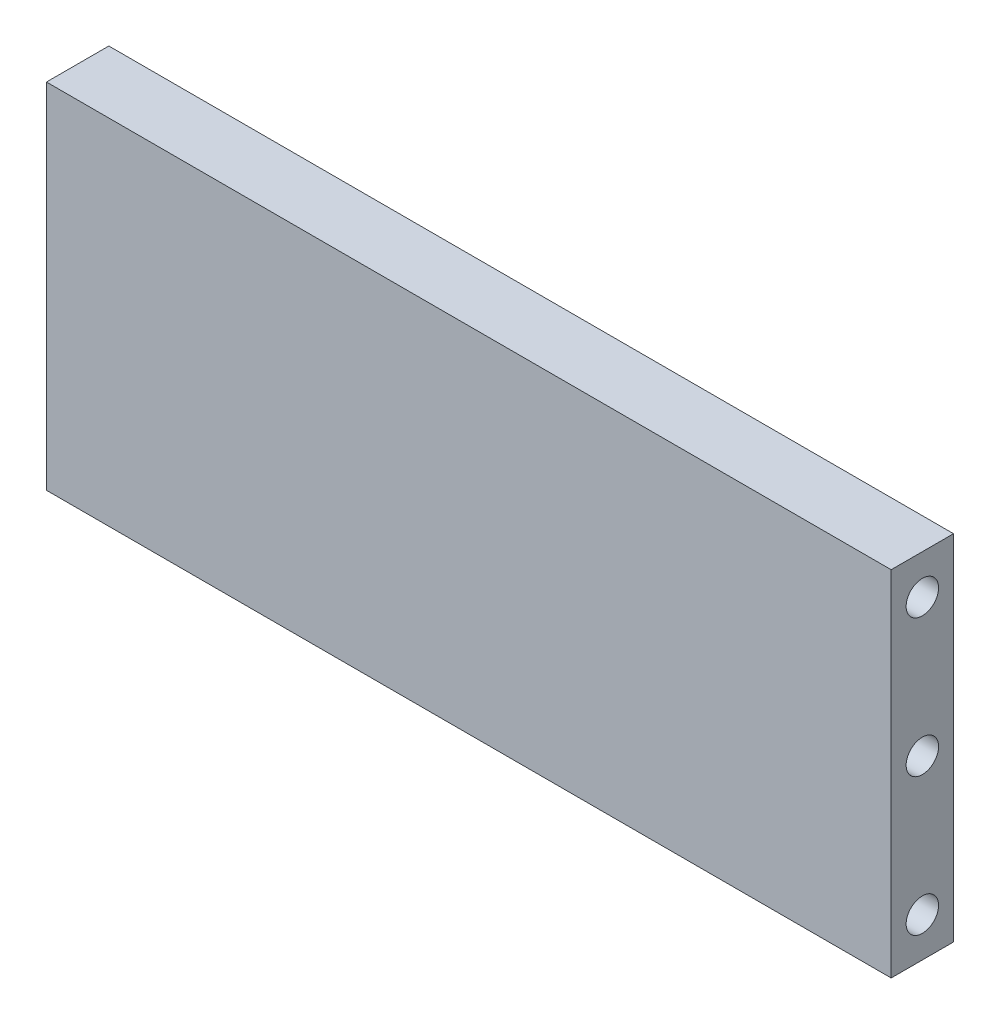
ISO-10303-21;
HEADER;
FILE_DESCRIPTION(('STEP AP214'),'2;1');
FILE_NAME('part.step','',(''),(''),'','','');
FILE_SCHEMA(('AUTOMOTIVE_DESIGN { 1 0 10303 214 1 1 1 1 }'));
ENDSEC;
DATA;
#1=APPLICATION_CONTEXT('core data for automotive mechanical design processes');
#2=APPLICATION_PROTOCOL_DEFINITION('international standard','automotive_design',2000,#1);
#3=PRODUCT_CONTEXT('',#1,'mechanical');
#4=PRODUCT('Part','Part','',(#3));
#5=PRODUCT_RELATED_PRODUCT_CATEGORY('part','',(#4));
#6=PRODUCT_DEFINITION_FORMATION('','',#4);
#7=PRODUCT_DEFINITION_CONTEXT('part definition',#1,'design');
#8=PRODUCT_DEFINITION('design','',#6,#7);
#9=PRODUCT_DEFINITION_SHAPE('','',#8);
#10=(LENGTH_UNIT() NAMED_UNIT(*) SI_UNIT(.MILLI.,.METRE.));
#11=(NAMED_UNIT(*) PLANE_ANGLE_UNIT() SI_UNIT($,.RADIAN.));
#12=(NAMED_UNIT(*) SI_UNIT($,.STERADIAN.) SOLID_ANGLE_UNIT());
#13=UNCERTAINTY_MEASURE_WITH_UNIT(LENGTH_MEASURE(1.E-05),#10,'distance_accuracy_value','');
#14=(GEOMETRIC_REPRESENTATION_CONTEXT(3) GLOBAL_UNCERTAINTY_ASSIGNED_CONTEXT((#13)) GLOBAL_UNIT_ASSIGNED_CONTEXT((#10,
#11,#12)) REPRESENTATION_CONTEXT('',''));
#15=CARTESIAN_POINT('',(0.,0.,0.));
#16=DIRECTION('',(0.,0.,1.));
#17=DIRECTION('',(1.,0.,0.));
#18=AXIS2_PLACEMENT_3D('',#15,#16,#17);
#19=CARTESIAN_POINT('',(43.,-18.,3.175));
#20=DIRECTION('',(-1.,0.,0.));
#21=DIRECTION('',(0.,0.,1.));
#22=AXIS2_PLACEMENT_3D('',#19,#20,#21);
#23=PLANE('',#22);
#24=CARTESIAN_POINT('',(43.,-14.,0.));
#25=DIRECTION('',(-1.,0.,0.));
#26=DIRECTION('',(0.,0.,1.));
#27=AXIS2_PLACEMENT_3D('',#24,#25,#26);
#28=CIRCLE('',#27,1.65);
#29=CARTESIAN_POINT('',(43.,-14.,1.65));
#30=VERTEX_POINT('',#29);
#31=EDGE_CURVE('E148',#30,#30,#28,.T.);
#32=ORIENTED_EDGE('',*,*,#31,.T.);
#33=EDGE_LOOP('',(#32));
#34=FACE_BOUND('',#33,.T.);
#35=CARTESIAN_POINT('',(43.,0.,0.));
#36=DIRECTION('',(-1.,0.,0.));
#37=DIRECTION('',(0.,0.,1.));
#38=AXIS2_PLACEMENT_3D('',#35,#36,#37);
#39=CIRCLE('',#38,1.65);
#40=CARTESIAN_POINT('',(43.,0.,1.65));
#41=VERTEX_POINT('',#40);
#42=EDGE_CURVE('E138',#41,#41,#39,.T.);
#43=ORIENTED_EDGE('',*,*,#42,.T.);
#44=EDGE_LOOP('',(#43));
#45=FACE_BOUND('',#44,.T.);
#46=CARTESIAN_POINT('',(43.,14.,0.));
#47=DIRECTION('',(-1.,0.,0.));
#48=DIRECTION('',(0.,0.,1.));
#49=AXIS2_PLACEMENT_3D('',#46,#47,#48);
#50=CIRCLE('',#49,1.65);
#51=CARTESIAN_POINT('',(43.,14.,1.65));
#52=VERTEX_POINT('',#51);
#53=EDGE_CURVE('E131',#52,#52,#50,.T.);
#54=ORIENTED_EDGE('',*,*,#53,.T.);
#55=EDGE_LOOP('',(#54));
#56=FACE_BOUND('',#55,.T.);
#57=DIRECTION('',(0.,1.,0.));
#58=VECTOR('',#57,1.);
#59=CARTESIAN_POINT('',(43.,-18.,-3.175));
#60=LINE('',#59,#58);
#61=CARTESIAN_POINT('',(43.,-18.,-3.175));
#62=VERTEX_POINT('',#61);
#63=CARTESIAN_POINT('',(43.,18.,-3.175));
#64=VERTEX_POINT('',#63);
#65=EDGE_CURVE('E105',#62,#64,#60,.T.);
#66=ORIENTED_EDGE('',*,*,#65,.T.);
#67=DIRECTION('',(0.,0.,-1.));
#68=VECTOR('',#67,1.);
#69=CARTESIAN_POINT('',(43.,18.,3.175));
#70=LINE('',#69,#68);
#71=CARTESIAN_POINT('',(43.,18.,3.175));
#72=VERTEX_POINT('',#71);
#73=EDGE_CURVE('E11',#72,#64,#70,.T.);
#74=ORIENTED_EDGE('',*,*,#73,.F.);
#75=DIRECTION('',(0.,1.,0.));
#76=VECTOR('',#75,1.);
#77=CARTESIAN_POINT('',(43.,-18.,3.175));
#78=LINE('',#77,#76);
#79=CARTESIAN_POINT('',(43.,-18.,3.175));
#80=VERTEX_POINT('',#79);
#81=EDGE_CURVE('E89',#80,#72,#78,.T.);
#82=ORIENTED_EDGE('',*,*,#81,.F.);
#83=DIRECTION('',(0.,0.,-1.));
#84=VECTOR('',#83,1.);
#85=CARTESIAN_POINT('',(43.,-18.,3.175));
#86=LINE('',#85,#84);
#87=EDGE_CURVE('E98',#80,#62,#86,.T.);
#88=ORIENTED_EDGE('',*,*,#87,.T.);
#89=EDGE_LOOP('',(#66,#74,#82,#88));
#90=FACE_BOUND('',#89,.T.);
#91=ADVANCED_FACE('F39',(#34,#45,#56,#90),#23,.F.);
#92=CARTESIAN_POINT('',(-43.,18.,3.175));
#93=DIRECTION('',(0.,-1.,0.));
#94=DIRECTION('',(0.,0.,-1.));
#95=AXIS2_PLACEMENT_3D('',#92,#93,#94);
#96=PLANE('',#95);
#97=DIRECTION('',(-1.,0.,0.));
#98=VECTOR('',#97,1.);
#99=CARTESIAN_POINT('',(-43.,18.,-3.175));
#100=LINE('',#99,#98);
#101=CARTESIAN_POINT('',(-43.,18.,-3.175));
#102=VERTEX_POINT('',#101);
#103=EDGE_CURVE('E94',#64,#102,#100,.T.);
#104=ORIENTED_EDGE('',*,*,#103,.T.);
#105=DIRECTION('',(0.,0.,-1.));
#106=VECTOR('',#105,1.);
#107=CARTESIAN_POINT('',(-43.,18.,3.175));
#108=LINE('',#107,#106);
#109=CARTESIAN_POINT('',(-43.,18.,3.175));
#110=VERTEX_POINT('',#109);
#111=EDGE_CURVE('E50',#110,#102,#108,.T.);
#112=ORIENTED_EDGE('',*,*,#111,.F.);
#113=DIRECTION('',(-1.,0.,0.));
#114=VECTOR('',#113,1.);
#115=CARTESIAN_POINT('',(-43.,18.,3.175));
#116=LINE('',#115,#114);
#117=EDGE_CURVE('E83',#72,#110,#116,.T.);
#118=ORIENTED_EDGE('',*,*,#117,.F.);
#119=ORIENTED_EDGE('',*,*,#73,.T.);
#120=EDGE_LOOP('',(#104,#112,#118,#119));
#121=FACE_BOUND('',#120,.T.);
#122=ADVANCED_FACE('F91',(#121),#96,.F.);
#123=CARTESIAN_POINT('',(-43.,-18.,3.175));
#124=DIRECTION('',(1.,0.,0.));
#125=DIRECTION('',(0.,0.,-1.));
#126=AXIS2_PLACEMENT_3D('',#123,#124,#125);
#127=PLANE('',#126);
#128=CARTESIAN_POINT('',(-43.,-14.,0.));
#129=DIRECTION('',(-1.,0.,0.));
#130=DIRECTION('',(0.,0.,1.));
#131=AXIS2_PLACEMENT_3D('',#128,#129,#130);
#132=CIRCLE('',#131,1.65);
#133=CARTESIAN_POINT('',(-43.,-14.,1.65));
#134=VERTEX_POINT('',#133);
#135=EDGE_CURVE('E129',#134,#134,#132,.T.);
#136=ORIENTED_EDGE('',*,*,#135,.F.);
#137=EDGE_LOOP('',(#136));
#138=FACE_BOUND('',#137,.T.);
#139=CARTESIAN_POINT('',(-43.,0.,0.));
#140=DIRECTION('',(-1.,0.,0.));
#141=DIRECTION('',(0.,0.,1.));
#142=AXIS2_PLACEMENT_3D('',#139,#140,#141);
#143=CIRCLE('',#142,1.65);
#144=CARTESIAN_POINT('',(-43.,0.,1.65));
#145=VERTEX_POINT('',#144);
#146=EDGE_CURVE('E127',#145,#145,#143,.T.);
#147=ORIENTED_EDGE('',*,*,#146,.F.);
#148=EDGE_LOOP('',(#147));
#149=FACE_BOUND('',#148,.T.);
#150=CARTESIAN_POINT('',(-43.,14.,0.));
#151=DIRECTION('',(-1.,0.,0.));
#152=DIRECTION('',(0.,0.,1.));
#153=AXIS2_PLACEMENT_3D('',#150,#151,#152);
#154=CIRCLE('',#153,1.65);
#155=CARTESIAN_POINT('',(-43.,14.,1.65));
#156=VERTEX_POINT('',#155);
#157=EDGE_CURVE('E116',#156,#156,#154,.T.);
#158=ORIENTED_EDGE('',*,*,#157,.F.);
#159=EDGE_LOOP('',(#158));
#160=FACE_BOUND('',#159,.T.);
#161=DIRECTION('',(0.,-1.,0.));
#162=VECTOR('',#161,1.);
#163=CARTESIAN_POINT('',(-43.,-18.,-3.175));
#164=LINE('',#163,#162);
#165=CARTESIAN_POINT('',(-43.,-18.,-3.175));
#166=VERTEX_POINT('',#165);
#167=EDGE_CURVE('E75',#102,#166,#164,.T.);
#168=ORIENTED_EDGE('',*,*,#167,.T.);
#169=DIRECTION('',(0.,0.,-1.));
#170=VECTOR('',#169,1.);
#171=CARTESIAN_POINT('',(-43.,-18.,3.175));
#172=LINE('',#171,#170);
#173=CARTESIAN_POINT('',(-43.,-18.,3.175));
#174=VERTEX_POINT('',#173);
#175=EDGE_CURVE('E92',#174,#166,#172,.T.);
#176=ORIENTED_EDGE('',*,*,#175,.F.);
#177=DIRECTION('',(0.,-1.,0.));
#178=VECTOR('',#177,1.);
#179=CARTESIAN_POINT('',(-43.,-18.,3.175));
#180=LINE('',#179,#178);
#181=EDGE_CURVE('E86',#110,#174,#180,.T.);
#182=ORIENTED_EDGE('',*,*,#181,.F.);
#183=ORIENTED_EDGE('',*,*,#111,.T.);
#184=EDGE_LOOP('',(#168,#176,#182,#183));
#185=FACE_BOUND('',#184,.T.);
#186=ADVANCED_FACE('F96',(#138,#149,#160,#185),#127,.F.);
#187=CARTESIAN_POINT('',(-43.,-18.,3.175));
#188=DIRECTION('',(0.,1.,0.));
#189=DIRECTION('',(-1.,0.,0.));
#190=AXIS2_PLACEMENT_3D('',#187,#188,#189);
#191=PLANE('',#190);
#192=DIRECTION('',(1.,0.,0.));
#193=VECTOR('',#192,1.);
#194=CARTESIAN_POINT('',(-43.,-18.,-3.175));
#195=LINE('',#194,#193);
#196=EDGE_CURVE('E79',#166,#62,#195,.T.);
#197=ORIENTED_EDGE('',*,*,#196,.T.);
#198=ORIENTED_EDGE('',*,*,#87,.F.);
#199=DIRECTION('',(1.,0.,0.));
#200=VECTOR('',#199,1.);
#201=CARTESIAN_POINT('',(-43.,-18.,3.175));
#202=LINE('',#201,#200);
#203=EDGE_CURVE('E54',#174,#80,#202,.T.);
#204=ORIENTED_EDGE('',*,*,#203,.F.);
#205=ORIENTED_EDGE('',*,*,#175,.T.);
#206=EDGE_LOOP('',(#197,#198,#204,#205));
#207=FACE_BOUND('',#206,.T.);
#208=ADVANCED_FACE('F109',(#207),#191,.F.);
#209=CARTESIAN_POINT('',(0.,0.,3.175));
#210=DIRECTION('',(0.,0.,-1.));
#211=DIRECTION('',(-1.,0.,0.));
#212=AXIS2_PLACEMENT_3D('',#209,#210,#211);
#213=PLANE('',#212);
#214=ORIENTED_EDGE('',*,*,#81,.T.);
#215=ORIENTED_EDGE('',*,*,#117,.T.);
#216=ORIENTED_EDGE('',*,*,#181,.T.);
#217=ORIENTED_EDGE('',*,*,#203,.T.);
#218=EDGE_LOOP('',(#214,#215,#216,#217));
#219=FACE_BOUND('',#218,.T.);
#220=ADVANCED_FACE('F88',(#219),#213,.F.);
#221=CARTESIAN_POINT('',(0.,0.,-3.175));
#222=DIRECTION('',(0.,0.,-1.));
#223=DIRECTION('',(-1.,0.,0.));
#224=AXIS2_PLACEMENT_3D('',#221,#222,#223);
#225=PLANE('',#224);
#226=ORIENTED_EDGE('',*,*,#65,.F.);
#227=ORIENTED_EDGE('',*,*,#196,.F.);
#228=ORIENTED_EDGE('',*,*,#167,.F.);
#229=ORIENTED_EDGE('',*,*,#103,.F.);
#230=EDGE_LOOP('',(#226,#227,#228,#229));
#231=FACE_BOUND('',#230,.T.);
#232=ADVANCED_FACE('F114',(#231),#225,.T.);
#233=CARTESIAN_POINT('',(-33.,14.,0.));
#234=DIRECTION('',(-1.,0.,0.));
#235=DIRECTION('',(0.,0.,1.));
#236=AXIS2_PLACEMENT_3D('',#233,#234,#235);
#237=CYLINDRICAL_SURFACE('',#236,1.65);
#238=CARTESIAN_POINT('',(-33.,14.,0.));
#239=DIRECTION('',(-1.,0.,0.));
#240=DIRECTION('',(0.,0.,1.));
#241=AXIS2_PLACEMENT_3D('',#238,#239,#240);
#242=CIRCLE('',#241,1.65);
#243=CARTESIAN_POINT('',(-33.,14.,1.65));
#244=VERTEX_POINT('',#243);
#245=EDGE_CURVE('E117',#244,#244,#242,.T.);
#246=ORIENTED_EDGE('',*,*,#245,.F.);
#247=EDGE_LOOP('',(#246));
#248=FACE_BOUND('',#247,.T.);
#249=ORIENTED_EDGE('',*,*,#157,.T.);
#250=EDGE_LOOP('',(#249));
#251=FACE_BOUND('',#250,.T.);
#252=ADVANCED_FACE('F204',(#248,#251),#237,.F.);
#253=CARTESIAN_POINT('',(-33.,14.,0.));
#254=DIRECTION('',(-1.,0.,0.));
#255=DIRECTION('',(0.,0.,1.));
#256=AXIS2_PLACEMENT_3D('',#253,#254,#255);
#257=PLANE('',#256);
#258=ORIENTED_EDGE('',*,*,#245,.T.);
#259=EDGE_LOOP('',(#258));
#260=FACE_BOUND('',#259,.T.);
#261=ADVANCED_FACE('F200',(#260),#257,.T.);
#262=CARTESIAN_POINT('',(-33.,0.,0.));
#263=DIRECTION('',(-1.,0.,0.));
#264=DIRECTION('',(0.,0.,1.));
#265=AXIS2_PLACEMENT_3D('',#262,#263,#264);
#266=CYLINDRICAL_SURFACE('',#265,1.65);
#267=CARTESIAN_POINT('',(-33.,0.,0.));
#268=DIRECTION('',(-1.,0.,0.));
#269=DIRECTION('',(0.,0.,1.));
#270=AXIS2_PLACEMENT_3D('',#267,#268,#269);
#271=CIRCLE('',#270,1.65);
#272=CARTESIAN_POINT('',(-33.,0.,1.65));
#273=VERTEX_POINT('',#272);
#274=EDGE_CURVE('E124',#273,#273,#271,.T.);
#275=ORIENTED_EDGE('',*,*,#274,.F.);
#276=EDGE_LOOP('',(#275));
#277=FACE_BOUND('',#276,.T.);
#278=ORIENTED_EDGE('',*,*,#146,.T.);
#279=EDGE_LOOP('',(#278));
#280=FACE_BOUND('',#279,.T.);
#281=ADVANCED_FACE('F198',(#277,#280),#266,.F.);
#282=CARTESIAN_POINT('',(-33.,0.,0.));
#283=DIRECTION('',(-1.,0.,0.));
#284=DIRECTION('',(0.,0.,1.));
#285=AXIS2_PLACEMENT_3D('',#282,#283,#284);
#286=PLANE('',#285);
#287=ORIENTED_EDGE('',*,*,#274,.T.);
#288=EDGE_LOOP('',(#287));
#289=FACE_BOUND('',#288,.T.);
#290=ADVANCED_FACE('F191',(#289),#286,.T.);
#291=CARTESIAN_POINT('',(-33.,-14.,0.));
#292=DIRECTION('',(-1.,0.,0.));
#293=DIRECTION('',(0.,0.,1.));
#294=AXIS2_PLACEMENT_3D('',#291,#292,#293);
#295=CYLINDRICAL_SURFACE('',#294,1.65);
#296=CARTESIAN_POINT('',(-33.,-14.,0.));
#297=DIRECTION('',(-1.,0.,0.));
#298=DIRECTION('',(0.,0.,1.));
#299=AXIS2_PLACEMENT_3D('',#296,#297,#298);
#300=CIRCLE('',#299,1.65);
#301=CARTESIAN_POINT('',(-33.,-14.,1.65));
#302=VERTEX_POINT('',#301);
#303=EDGE_CURVE('E104',#302,#302,#300,.T.);
#304=ORIENTED_EDGE('',*,*,#303,.F.);
#305=EDGE_LOOP('',(#304));
#306=FACE_BOUND('',#305,.T.);
#307=ORIENTED_EDGE('',*,*,#135,.T.);
#308=EDGE_LOOP('',(#307));
#309=FACE_BOUND('',#308,.T.);
#310=ADVANCED_FACE('F190',(#306,#309),#295,.F.);
#311=CARTESIAN_POINT('',(-33.,-14.,0.));
#312=DIRECTION('',(-1.,0.,0.));
#313=DIRECTION('',(0.,0.,1.));
#314=AXIS2_PLACEMENT_3D('',#311,#312,#313);
#315=PLANE('',#314);
#316=ORIENTED_EDGE('',*,*,#303,.T.);
#317=EDGE_LOOP('',(#316));
#318=FACE_BOUND('',#317,.T.);
#319=ADVANCED_FACE('F179',(#318),#315,.T.);
#320=CARTESIAN_POINT('',(33.,14.,0.));
#321=DIRECTION('',(1.,0.,0.));
#322=DIRECTION('',(0.,0.,-1.));
#323=AXIS2_PLACEMENT_3D('',#320,#321,#322);
#324=CYLINDRICAL_SURFACE('',#323,1.65);
#325=CARTESIAN_POINT('',(33.,14.,0.));
#326=DIRECTION('',(-1.,0.,0.));
#327=DIRECTION('',(0.,0.,1.));
#328=AXIS2_PLACEMENT_3D('',#325,#326,#327);
#329=CIRCLE('',#328,1.65);
#330=CARTESIAN_POINT('',(33.,14.,1.65));
#331=VERTEX_POINT('',#330);
#332=EDGE_CURVE('E140',#331,#331,#329,.T.);
#333=ORIENTED_EDGE('',*,*,#332,.T.);
#334=EDGE_LOOP('',(#333));
#335=FACE_BOUND('',#334,.T.);
#336=ORIENTED_EDGE('',*,*,#53,.F.);
#337=EDGE_LOOP('',(#336));
#338=FACE_BOUND('',#337,.T.);
#339=ADVANCED_FACE('F177',(#335,#338),#324,.F.);
#340=CARTESIAN_POINT('',(33.,14.,0.));
#341=DIRECTION('',(1.,0.,0.));
#342=DIRECTION('',(0.,0.,1.));
#343=AXIS2_PLACEMENT_3D('',#340,#341,#342);
#344=PLANE('',#343);
#345=ORIENTED_EDGE('',*,*,#332,.F.);
#346=EDGE_LOOP('',(#345));
#347=FACE_BOUND('',#346,.T.);
#348=ADVANCED_FACE('F180',(#347),#344,.T.);
#349=CARTESIAN_POINT('',(33.,0.,0.));
#350=DIRECTION('',(1.,0.,0.));
#351=DIRECTION('',(0.,0.,-1.));
#352=AXIS2_PLACEMENT_3D('',#349,#350,#351);
#353=CYLINDRICAL_SURFACE('',#352,1.65);
#354=CARTESIAN_POINT('',(33.,0.,0.));
#355=DIRECTION('',(-1.,0.,0.));
#356=DIRECTION('',(0.,0.,1.));
#357=AXIS2_PLACEMENT_3D('',#354,#355,#356);
#358=CIRCLE('',#357,1.65);
#359=CARTESIAN_POINT('',(33.,0.,1.65));
#360=VERTEX_POINT('',#359);
#361=EDGE_CURVE('E141',#360,#360,#358,.T.);
#362=ORIENTED_EDGE('',*,*,#361,.T.);
#363=EDGE_LOOP('',(#362));
#364=FACE_BOUND('',#363,.T.);
#365=ORIENTED_EDGE('',*,*,#42,.F.);
#366=EDGE_LOOP('',(#365));
#367=FACE_BOUND('',#366,.T.);
#368=ADVANCED_FACE('F184',(#364,#367),#353,.F.);
#369=CARTESIAN_POINT('',(33.,0.,0.));
#370=DIRECTION('',(1.,0.,0.));
#371=DIRECTION('',(0.,0.,1.));
#372=AXIS2_PLACEMENT_3D('',#369,#370,#371);
#373=PLANE('',#372);
#374=ORIENTED_EDGE('',*,*,#361,.F.);
#375=EDGE_LOOP('',(#374));
#376=FACE_BOUND('',#375,.T.);
#377=ADVANCED_FACE('F161',(#376),#373,.T.);
#378=CARTESIAN_POINT('',(33.,-14.,0.));
#379=DIRECTION('',(1.,0.,0.));
#380=DIRECTION('',(0.,0.,-1.));
#381=AXIS2_PLACEMENT_3D('',#378,#379,#380);
#382=CYLINDRICAL_SURFACE('',#381,1.65);
#383=CARTESIAN_POINT('',(33.,-14.,0.));
#384=DIRECTION('',(-1.,0.,0.));
#385=DIRECTION('',(0.,0.,1.));
#386=AXIS2_PLACEMENT_3D('',#383,#384,#385);
#387=CIRCLE('',#386,1.65);
#388=CARTESIAN_POINT('',(33.,-14.,1.65));
#389=VERTEX_POINT('',#388);
#390=EDGE_CURVE('E118',#389,#389,#387,.T.);
#391=ORIENTED_EDGE('',*,*,#390,.T.);
#392=EDGE_LOOP('',(#391));
#393=FACE_BOUND('',#392,.T.);
#394=ORIENTED_EDGE('',*,*,#31,.F.);
#395=EDGE_LOOP('',(#394));
#396=FACE_BOUND('',#395,.T.);
#397=ADVANCED_FACE('F155',(#393,#396),#382,.F.);
#398=CARTESIAN_POINT('',(33.,-14.,0.));
#399=DIRECTION('',(1.,0.,0.));
#400=DIRECTION('',(0.,0.,1.));
#401=AXIS2_PLACEMENT_3D('',#398,#399,#400);
#402=PLANE('',#401);
#403=ORIENTED_EDGE('',*,*,#390,.F.);
#404=EDGE_LOOP('',(#403));
#405=FACE_BOUND('',#404,.T.);
#406=ADVANCED_FACE('F154',(#405),#402,.T.);
#407=CLOSED_SHELL('',(#91,#122,#186,#208,#220,#232,#252,#261,#281,#290,#310,#319,#339,#348,#368,
#377,#397,#406));
#408=MANIFOLD_SOLID_BREP('B2',#407);
#409=ADVANCED_BREP_SHAPE_REPRESENTATION('',(#18,#408),#14);
#410=SHAPE_DEFINITION_REPRESENTATION(#9,#409);
ENDSEC;
END-ISO-10303-21;
